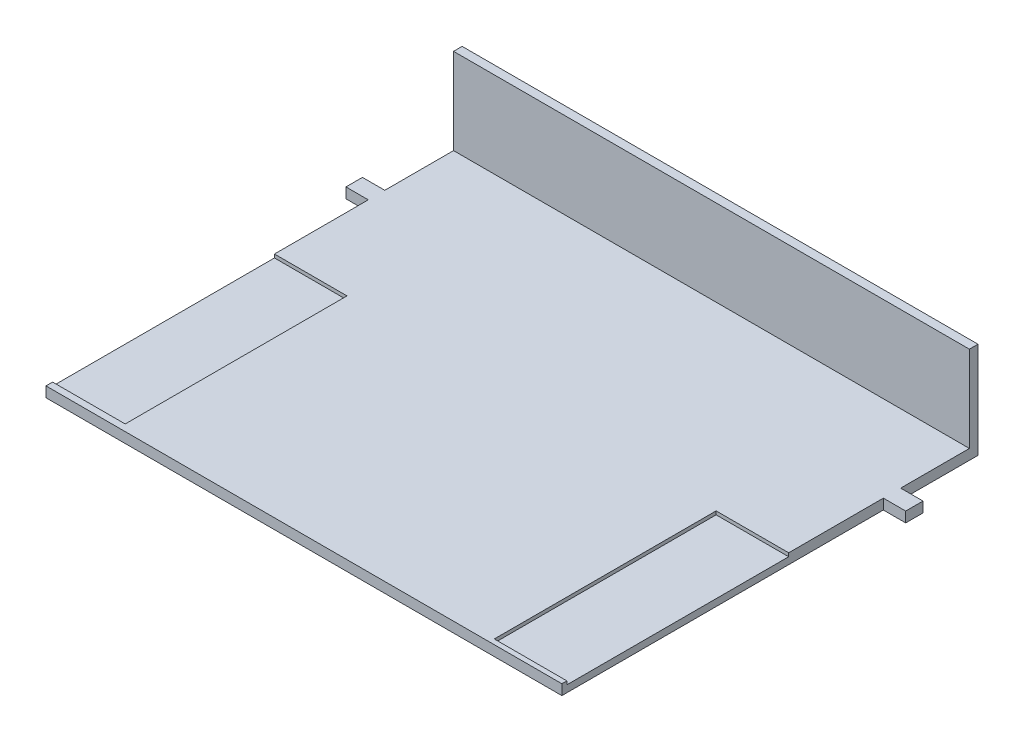
ISO-10303-21;
HEADER;
FILE_DESCRIPTION(('STEP AP214'),'2;1');
FILE_NAME('part.step','',(''),(''),'','','');
FILE_SCHEMA(('AUTOMOTIVE_DESIGN { 1 0 10303 214 1 1 1 1 }'));
ENDSEC;
DATA;
#1=APPLICATION_CONTEXT('core data for automotive mechanical design processes');
#2=APPLICATION_PROTOCOL_DEFINITION('international standard','automotive_design',2000,#1);
#3=PRODUCT_CONTEXT('',#1,'mechanical');
#4=PRODUCT('Part','Part','',(#3));
#5=PRODUCT_RELATED_PRODUCT_CATEGORY('part','',(#4));
#6=PRODUCT_DEFINITION_FORMATION('','',#4);
#7=PRODUCT_DEFINITION_CONTEXT('part definition',#1,'design');
#8=PRODUCT_DEFINITION('design','',#6,#7);
#9=PRODUCT_DEFINITION_SHAPE('','',#8);
#10=(LENGTH_UNIT() NAMED_UNIT(*) SI_UNIT(.MILLI.,.METRE.));
#11=(NAMED_UNIT(*) PLANE_ANGLE_UNIT() SI_UNIT($,.RADIAN.));
#12=(NAMED_UNIT(*) SI_UNIT($,.STERADIAN.) SOLID_ANGLE_UNIT());
#13=UNCERTAINTY_MEASURE_WITH_UNIT(LENGTH_MEASURE(1.E-05),#10,'distance_accuracy_value','');
#14=(GEOMETRIC_REPRESENTATION_CONTEXT(3) GLOBAL_UNCERTAINTY_ASSIGNED_CONTEXT((#13)) GLOBAL_UNIT_ASSIGNED_CONTEXT((#10,
#11,#12)) REPRESENTATION_CONTEXT('',''));
#15=CARTESIAN_POINT('',(0.,0.,0.));
#16=DIRECTION('',(0.,0.,1.));
#17=DIRECTION('',(1.,0.,0.));
#18=AXIS2_PLACEMENT_3D('',#15,#16,#17);
#19=CARTESIAN_POINT('',(0.,3.,121.));
#20=DIRECTION('',(0.,1.,0.));
#21=DIRECTION('',(0.,0.,1.));
#22=AXIS2_PLACEMENT_3D('',#19,#20,#21);
#23=PLANE('',#22);
#24=DIRECTION('',(0.,0.,-1.));
#25=VECTOR('',#24,1.);
#26=CARTESIAN_POINT('',(150.,3.,121.));
#27=LINE('',#26,#25);
#28=CARTESIAN_POINT('',(150.,3.,22.4873306391878));
#29=VERTEX_POINT('',#28);
#30=CARTESIAN_POINT('',(150.,3.,2.5));
#31=VERTEX_POINT('',#30);
#32=EDGE_CURVE('E386',#29,#31,#27,.T.);
#33=ORIENTED_EDGE('',*,*,#32,.T.);
#34=DIRECTION('',(-1.,0.,0.));
#35=VECTOR('',#34,1.);
#36=CARTESIAN_POINT('',(150.,3.,2.5));
#37=LINE('',#36,#35);
#38=CARTESIAN_POINT('',(0.,3.,2.5));
#39=VERTEX_POINT('',#38);
#40=EDGE_CURVE('E215',#31,#39,#37,.T.);
#41=ORIENTED_EDGE('',*,*,#40,.T.);
#42=DIRECTION('',(0.,0.,-1.));
#43=VECTOR('',#42,1.);
#44=CARTESIAN_POINT('',(0.,3.,121.));
#45=LINE('',#44,#43);
#46=CARTESIAN_POINT('',(0.,3.,22.4873306391878));
#47=VERTEX_POINT('',#46);
#48=EDGE_CURVE('E50',#47,#39,#45,.T.);
#49=ORIENTED_EDGE('',*,*,#48,.F.);
#50=DIRECTION('',(-1.,0.,0.));
#51=VECTOR('',#50,1.);
#52=CARTESIAN_POINT('',(0.,3.,22.4873306391878));
#53=LINE('',#52,#51);
#54=CARTESIAN_POINT('',(-6.5,3.,22.4873306391878));
#55=VERTEX_POINT('',#54);
#56=EDGE_CURVE('E263',#47,#55,#53,.T.);
#57=ORIENTED_EDGE('',*,*,#56,.T.);
#58=DIRECTION('',(0.,0.,1.));
#59=VECTOR('',#58,1.);
#60=CARTESIAN_POINT('',(-6.5,3.,22.4873306391878));
#61=LINE('',#60,#59);
#62=CARTESIAN_POINT('',(-6.5,3.,27.2873306391878));
#63=VERTEX_POINT('',#62);
#64=EDGE_CURVE('E267',#55,#63,#61,.T.);
#65=ORIENTED_EDGE('',*,*,#64,.T.);
#66=DIRECTION('',(1.,0.,0.));
#67=VECTOR('',#66,1.);
#68=CARTESIAN_POINT('',(-6.5,3.,27.2873306391878));
#69=LINE('',#68,#67);
#70=CARTESIAN_POINT('',(0.,3.,27.2873306391878));
#71=VERTEX_POINT('',#70);
#72=EDGE_CURVE('E260',#63,#71,#69,.T.);
#73=ORIENTED_EDGE('',*,*,#72,.T.);
#74=CARTESIAN_POINT('',(0.,3.,54.5746612783755));
#75=VERTEX_POINT('',#74);
#76=EDGE_CURVE('E48',#75,#71,#45,.T.);
#77=ORIENTED_EDGE('',*,*,#76,.F.);
#78=DIRECTION('',(-1.,0.,0.));
#79=VECTOR('',#78,1.);
#80=CARTESIAN_POINT('',(21.1,3.,54.5746612783755));
#81=LINE('',#80,#79);
#82=CARTESIAN_POINT('',(21.1,3.,54.5746612783755));
#83=VERTEX_POINT('',#82);
#84=EDGE_CURVE('E323',#83,#75,#81,.T.);
#85=ORIENTED_EDGE('',*,*,#84,.F.);
#86=DIRECTION('',(0.,0.,-1.));
#87=VECTOR('',#86,1.);
#88=CARTESIAN_POINT('',(21.1,3.,119.074661278376));
#89=LINE('',#88,#87);
#90=CARTESIAN_POINT('',(21.1,3.,119.074661278376));
#91=VERTEX_POINT('',#90);
#92=EDGE_CURVE('E336',#91,#83,#89,.T.);
#93=ORIENTED_EDGE('',*,*,#92,.F.);
#94=DIRECTION('',(1.,0.,0.));
#95=VECTOR('',#94,1.);
#96=CARTESIAN_POINT('',(0.,3.,119.074661278376));
#97=LINE('',#96,#95);
#98=CARTESIAN_POINT('',(0.,3.,119.074661278376));
#99=VERTEX_POINT('',#98);
#100=EDGE_CURVE('E351',#99,#91,#97,.T.);
#101=ORIENTED_EDGE('',*,*,#100,.F.);
#102=CARTESIAN_POINT('',(0.,3.,121.));
#103=VERTEX_POINT('',#102);
#104=EDGE_CURVE('E11',#103,#99,#45,.T.);
#105=ORIENTED_EDGE('',*,*,#104,.F.);
#106=DIRECTION('',(1.,0.,0.));
#107=VECTOR('',#106,1.);
#108=CARTESIAN_POINT('',(0.,3.,121.));
#109=LINE('',#108,#107);
#110=CARTESIAN_POINT('',(150.,3.,121.));
#111=VERTEX_POINT('',#110);
#112=EDGE_CURVE('E371',#103,#111,#109,.T.);
#113=ORIENTED_EDGE('',*,*,#112,.T.);
#114=CARTESIAN_POINT('',(150.,3.,119.548299377698));
#115=VERTEX_POINT('',#114);
#116=EDGE_CURVE('E42',#111,#115,#27,.T.);
#117=ORIENTED_EDGE('',*,*,#116,.T.);
#118=DIRECTION('',(1.,0.,0.));
#119=VECTOR('',#118,1.);
#120=CARTESIAN_POINT('',(150.,3.,119.548299377698));
#121=LINE('',#120,#119);
#122=CARTESIAN_POINT('',(128.9,3.,119.548299377698));
#123=VERTEX_POINT('',#122);
#124=EDGE_CURVE('E298',#123,#115,#121,.T.);
#125=ORIENTED_EDGE('',*,*,#124,.F.);
#126=DIRECTION('',(0.,0.,1.));
#127=VECTOR('',#126,1.);
#128=CARTESIAN_POINT('',(128.9,3.,119.548299377698));
#129=LINE('',#128,#127);
#130=CARTESIAN_POINT('',(128.9,3.,55.0482993776977));
#131=VERTEX_POINT('',#130);
#132=EDGE_CURVE('E313',#131,#123,#129,.T.);
#133=ORIENTED_EDGE('',*,*,#132,.F.);
#134=DIRECTION('',(-1.,0.,0.));
#135=VECTOR('',#134,1.);
#136=CARTESIAN_POINT('',(128.9,3.,55.0482993776977));
#137=LINE('',#136,#135);
#138=CARTESIAN_POINT('',(150.,3.,55.0482993776977));
#139=VERTEX_POINT('',#138);
#140=EDGE_CURVE('E292',#139,#131,#137,.T.);
#141=ORIENTED_EDGE('',*,*,#140,.F.);
#142=CARTESIAN_POINT('',(150.,3.,27.5241496888489));
#143=VERTEX_POINT('',#142);
#144=EDGE_CURVE('E413',#139,#143,#27,.T.);
#145=ORIENTED_EDGE('',*,*,#144,.T.);
#146=DIRECTION('',(1.,0.,0.));
#147=VECTOR('',#146,1.);
#148=CARTESIAN_POINT('',(150.,3.,27.5241496888489));
#149=LINE('',#148,#147);
#150=CARTESIAN_POINT('',(156.5,3.,27.5241496888489));
#151=VERTEX_POINT('',#150);
#152=EDGE_CURVE('E65',#143,#151,#149,.T.);
#153=ORIENTED_EDGE('',*,*,#152,.T.);
#154=DIRECTION('',(0.,0.,-1.));
#155=VECTOR('',#154,1.);
#156=CARTESIAN_POINT('',(156.5,3.,27.5241496888489));
#157=LINE('',#156,#155);
#158=CARTESIAN_POINT('',(156.5,3.,22.4873306391878));
#159=VERTEX_POINT('',#158);
#160=EDGE_CURVE('E231',#151,#159,#157,.T.);
#161=ORIENTED_EDGE('',*,*,#160,.T.);
#162=DIRECTION('',(-1.,0.,0.));
#163=VECTOR('',#162,1.);
#164=CARTESIAN_POINT('',(156.5,3.,22.4873306391878));
#165=LINE('',#164,#163);
#166=EDGE_CURVE('E225',#159,#29,#165,.T.);
#167=ORIENTED_EDGE('',*,*,#166,.T.);
#168=EDGE_LOOP('',(#33,#41,#49,#57,#65,#73,#77,#85,#93,#101,#105,#113,#117,#125,#133,#141,#145,
#153,#161,#167));
#169=FACE_BOUND('',#168,.T.);
#170=ADVANCED_FACE('F39',(#169),#23,.T.);
#171=CARTESIAN_POINT('',(150.,0.,121.));
#172=DIRECTION('',(-1.,0.,0.));
#173=DIRECTION('',(0.,0.,1.));
#174=AXIS2_PLACEMENT_3D('',#171,#172,#173);
#175=PLANE('',#174);
#176=DIRECTION('',(0.,1.,0.));
#177=VECTOR('',#176,1.);
#178=CARTESIAN_POINT('',(150.,0.,22.4873306391878));
#179=LINE('',#178,#177);
#180=CARTESIAN_POINT('',(150.,0.,22.4873306391878));
#181=VERTEX_POINT('',#180);
#182=EDGE_CURVE('E239',#181,#29,#179,.T.);
#183=ORIENTED_EDGE('',*,*,#182,.F.);
#184=DIRECTION('',(0.,0.,-1.));
#185=VECTOR('',#184,1.);
#186=CARTESIAN_POINT('',(150.,0.,121.));
#187=LINE('',#186,#185);
#188=CARTESIAN_POINT('',(150.,0.,0.));
#189=VERTEX_POINT('',#188);
#190=EDGE_CURVE('E402',#181,#189,#187,.T.);
#191=ORIENTED_EDGE('',*,*,#190,.T.);
#192=DIRECTION('',(0.,1.,0.));
#193=VECTOR('',#192,1.);
#194=CARTESIAN_POINT('',(150.,0.,0.));
#195=LINE('',#194,#193);
#196=CARTESIAN_POINT('',(150.,28.,0.));
#197=VERTEX_POINT('',#196);
#198=EDGE_CURVE('E361',#189,#197,#195,.T.);
#199=ORIENTED_EDGE('',*,*,#198,.T.);
#200=DIRECTION('',(0.,0.,-1.));
#201=VECTOR('',#200,1.);
#202=CARTESIAN_POINT('',(150.,28.,2.5));
#203=LINE('',#202,#201);
#204=CARTESIAN_POINT('',(150.,28.,2.5));
#205=VERTEX_POINT('',#204);
#206=EDGE_CURVE('E203',#205,#197,#203,.T.);
#207=ORIENTED_EDGE('',*,*,#206,.F.);
#208=DIRECTION('',(0.,-1.,0.));
#209=VECTOR('',#208,1.);
#210=CARTESIAN_POINT('',(150.,3.,2.5));
#211=LINE('',#210,#209);
#212=EDGE_CURVE('E204',#205,#31,#211,.T.);
#213=ORIENTED_EDGE('',*,*,#212,.T.);
#214=ORIENTED_EDGE('',*,*,#32,.F.);
#215=EDGE_LOOP('',(#183,#191,#199,#207,#213,#214));
#216=FACE_BOUND('',#215,.T.);
#217=ADVANCED_FACE('F423',(#216),#175,.F.);
#218=CARTESIAN_POINT('',(0.,0.,121.));
#219=DIRECTION('',(-1.,0.,0.));
#220=DIRECTION('',(0.,0.,1.));
#221=AXIS2_PLACEMENT_3D('',#218,#219,#220);
#222=PLANE('',#221);
#223=ORIENTED_EDGE('',*,*,#76,.T.);
#224=DIRECTION('',(0.,-1.,0.));
#225=VECTOR('',#224,1.);
#226=CARTESIAN_POINT('',(0.,3.,27.2873306391878));
#227=LINE('',#226,#225);
#228=CARTESIAN_POINT('',(0.,0.,27.2873306391878));
#229=VERTEX_POINT('',#228);
#230=EDGE_CURVE('E288',#71,#229,#227,.T.);
#231=ORIENTED_EDGE('',*,*,#230,.T.);
#232=DIRECTION('',(0.,0.,-1.));
#233=VECTOR('',#232,1.);
#234=CARTESIAN_POINT('',(0.,0.,121.));
#235=LINE('',#234,#233);
#236=CARTESIAN_POINT('',(0.,0.,121.));
#237=VERTEX_POINT('',#236);
#238=EDGE_CURVE('E395',#237,#229,#235,.T.);
#239=ORIENTED_EDGE('',*,*,#238,.F.);
#240=DIRECTION('',(0.,1.,0.));
#241=VECTOR('',#240,1.);
#242=CARTESIAN_POINT('',(0.,0.,121.));
#243=LINE('',#242,#241);
#244=EDGE_CURVE('E382',#237,#103,#243,.T.);
#245=ORIENTED_EDGE('',*,*,#244,.T.);
#246=ORIENTED_EDGE('',*,*,#104,.T.);
#247=DIRECTION('',(0.,1.,0.));
#248=VECTOR('',#247,1.);
#249=CARTESIAN_POINT('',(0.,2.,119.074661278376));
#250=LINE('',#249,#248);
#251=CARTESIAN_POINT('',(0.,2.,119.074661278376));
#252=VERTEX_POINT('',#251);
#253=EDGE_CURVE('E365',#252,#99,#250,.T.);
#254=ORIENTED_EDGE('',*,*,#253,.F.);
#255=DIRECTION('',(0.,0.,1.));
#256=VECTOR('',#255,1.);
#257=CARTESIAN_POINT('',(0.,2.,54.5746612783755));
#258=LINE('',#257,#256);
#259=CARTESIAN_POINT('',(0.,2.,54.5746612783755));
#260=VERTEX_POINT('',#259);
#261=EDGE_CURVE('E335',#260,#252,#258,.T.);
#262=ORIENTED_EDGE('',*,*,#261,.F.);
#263=DIRECTION('',(0.,1.,0.));
#264=VECTOR('',#263,1.);
#265=CARTESIAN_POINT('',(0.,2.,54.5746612783755));
#266=LINE('',#265,#264);
#267=EDGE_CURVE('E348',#260,#75,#266,.T.);
#268=ORIENTED_EDGE('',*,*,#267,.T.);
#269=EDGE_LOOP('',(#223,#231,#239,#245,#246,#254,#262,#268));
#270=FACE_BOUND('',#269,.T.);
#271=ADVANCED_FACE('F448',(#270),#222,.T.);
#272=DIRECTION('',(0.,-1.,0.));
#273=VECTOR('',#272,1.);
#274=CARTESIAN_POINT('',(0.,3.,22.4873306391878));
#275=LINE('',#274,#273);
#276=CARTESIAN_POINT('',(0.,0.,22.4873306391878));
#277=VERTEX_POINT('',#276);
#278=EDGE_CURVE('E285',#47,#277,#275,.T.);
#279=ORIENTED_EDGE('',*,*,#278,.F.);
#280=ORIENTED_EDGE('',*,*,#48,.T.);
#281=DIRECTION('',(0.,1.,0.));
#282=VECTOR('',#281,1.);
#283=CARTESIAN_POINT('',(0.,28.,2.5));
#284=LINE('',#283,#282);
#285=CARTESIAN_POINT('',(0.,28.,2.5));
#286=VERTEX_POINT('',#285);
#287=EDGE_CURVE('E57',#39,#286,#284,.T.);
#288=ORIENTED_EDGE('',*,*,#287,.T.);
#289=DIRECTION('',(0.,0.,-1.));
#290=VECTOR('',#289,1.);
#291=CARTESIAN_POINT('',(0.,28.,2.5));
#292=LINE('',#291,#290);
#293=CARTESIAN_POINT('',(0.,28.,0.));
#294=VERTEX_POINT('',#293);
#295=EDGE_CURVE('E193',#286,#294,#292,.T.);
#296=ORIENTED_EDGE('',*,*,#295,.T.);
#297=DIRECTION('',(0.,1.,0.));
#298=VECTOR('',#297,1.);
#299=CARTESIAN_POINT('',(0.,0.,0.));
#300=LINE('',#299,#298);
#301=CARTESIAN_POINT('',(0.,0.,0.));
#302=VERTEX_POINT('',#301);
#303=EDGE_CURVE('E376',#302,#294,#300,.T.);
#304=ORIENTED_EDGE('',*,*,#303,.F.);
#305=EDGE_CURVE('E398',#277,#302,#235,.T.);
#306=ORIENTED_EDGE('',*,*,#305,.F.);
#307=EDGE_LOOP('',(#279,#280,#288,#296,#304,#306));
#308=FACE_BOUND('',#307,.T.);
#309=ADVANCED_FACE('F212',(#308),#222,.T.);
#310=CARTESIAN_POINT('',(0.,0.,121.));
#311=DIRECTION('',(0.,1.,0.));
#312=DIRECTION('',(0.,0.,1.));
#313=AXIS2_PLACEMENT_3D('',#310,#311,#312);
#314=PLANE('',#313);
#315=DIRECTION('',(1.,0.,0.));
#316=VECTOR('',#315,1.);
#317=CARTESIAN_POINT('',(0.,0.,0.));
#318=LINE('',#317,#316);
#319=EDGE_CURVE('E389',#302,#189,#318,.T.);
#320=ORIENTED_EDGE('',*,*,#319,.T.);
#321=ORIENTED_EDGE('',*,*,#190,.F.);
#322=DIRECTION('',(-1.,0.,0.));
#323=VECTOR('',#322,1.);
#324=CARTESIAN_POINT('',(156.5,0.,22.4873306391878));
#325=LINE('',#324,#323);
#326=CARTESIAN_POINT('',(156.5,0.,22.4873306391878));
#327=VERTEX_POINT('',#326);
#328=EDGE_CURVE('E227',#327,#181,#325,.T.);
#329=ORIENTED_EDGE('',*,*,#328,.F.);
#330=DIRECTION('',(0.,0.,-1.));
#331=VECTOR('',#330,1.);
#332=CARTESIAN_POINT('',(156.5,0.,27.5241496888489));
#333=LINE('',#332,#331);
#334=CARTESIAN_POINT('',(156.5,0.,27.5241496888489));
#335=VERTEX_POINT('',#334);
#336=EDGE_CURVE('E235',#335,#327,#333,.T.);
#337=ORIENTED_EDGE('',*,*,#336,.F.);
#338=DIRECTION('',(1.,0.,0.));
#339=VECTOR('',#338,1.);
#340=CARTESIAN_POINT('',(150.,0.,27.5241496888489));
#341=LINE('',#340,#339);
#342=CARTESIAN_POINT('',(150.,0.,27.5241496888489));
#343=VERTEX_POINT('',#342);
#344=EDGE_CURVE('E230',#343,#335,#341,.T.);
#345=ORIENTED_EDGE('',*,*,#344,.F.);
#346=CARTESIAN_POINT('',(150.,0.,121.));
#347=VERTEX_POINT('',#346);
#348=EDGE_CURVE('E399',#347,#343,#187,.T.);
#349=ORIENTED_EDGE('',*,*,#348,.F.);
#350=DIRECTION('',(1.,0.,0.));
#351=VECTOR('',#350,1.);
#352=CARTESIAN_POINT('',(0.,0.,121.));
#353=LINE('',#352,#351);
#354=EDGE_CURVE('E379',#237,#347,#353,.T.);
#355=ORIENTED_EDGE('',*,*,#354,.F.);
#356=ORIENTED_EDGE('',*,*,#238,.T.);
#357=DIRECTION('',(1.,0.,0.));
#358=VECTOR('',#357,1.);
#359=CARTESIAN_POINT('',(-6.5,0.,27.2873306391878));
#360=LINE('',#359,#358);
#361=CARTESIAN_POINT('',(-6.5,0.,27.2873306391878));
#362=VERTEX_POINT('',#361);
#363=EDGE_CURVE('E251',#362,#229,#360,.T.);
#364=ORIENTED_EDGE('',*,*,#363,.F.);
#365=DIRECTION('',(0.,0.,1.));
#366=VECTOR('',#365,1.);
#367=CARTESIAN_POINT('',(-6.5,0.,22.4873306391878));
#368=LINE('',#367,#366);
#369=CARTESIAN_POINT('',(-6.5,0.,22.4873306391878));
#370=VERTEX_POINT('',#369);
#371=EDGE_CURVE('E264',#370,#362,#368,.T.);
#372=ORIENTED_EDGE('',*,*,#371,.F.);
#373=DIRECTION('',(-1.,0.,0.));
#374=VECTOR('',#373,1.);
#375=CARTESIAN_POINT('',(0.,0.,22.4873306391878));
#376=LINE('',#375,#374);
#377=EDGE_CURVE('E273',#277,#370,#376,.T.);
#378=ORIENTED_EDGE('',*,*,#377,.F.);
#379=ORIENTED_EDGE('',*,*,#305,.T.);
#380=EDGE_LOOP('',(#320,#321,#329,#337,#345,#349,#355,#356,#364,#372,#378,#379));
#381=FACE_BOUND('',#380,.T.);
#382=ADVANCED_FACE('F431',(#381),#314,.F.);
#383=ORIENTED_EDGE('',*,*,#348,.T.);
#384=DIRECTION('',(0.,1.,0.));
#385=VECTOR('',#384,1.);
#386=CARTESIAN_POINT('',(150.,0.,27.5241496888489));
#387=LINE('',#386,#385);
#388=EDGE_CURVE('E255',#343,#143,#387,.T.);
#389=ORIENTED_EDGE('',*,*,#388,.T.);
#390=ORIENTED_EDGE('',*,*,#144,.F.);
#391=DIRECTION('',(0.,1.,0.));
#392=VECTOR('',#391,1.);
#393=CARTESIAN_POINT('',(150.,2.,55.0482993776977));
#394=LINE('',#393,#392);
#395=CARTESIAN_POINT('',(150.,2.,55.0482993776977));
#396=VERTEX_POINT('',#395);
#397=EDGE_CURVE('E309',#396,#139,#394,.T.);
#398=ORIENTED_EDGE('',*,*,#397,.F.);
#399=DIRECTION('',(0.,0.,-1.));
#400=VECTOR('',#399,1.);
#401=CARTESIAN_POINT('',(150.,2.,119.548299377698));
#402=LINE('',#401,#400);
#403=CARTESIAN_POINT('',(150.,2.,119.548299377698));
#404=VERTEX_POINT('',#403);
#405=EDGE_CURVE('E293',#404,#396,#402,.T.);
#406=ORIENTED_EDGE('',*,*,#405,.F.);
#407=DIRECTION('',(0.,1.,0.));
#408=VECTOR('',#407,1.);
#409=CARTESIAN_POINT('',(150.,2.,119.548299377698));
#410=LINE('',#409,#408);
#411=EDGE_CURVE('E319',#404,#115,#410,.T.);
#412=ORIENTED_EDGE('',*,*,#411,.T.);
#413=ORIENTED_EDGE('',*,*,#116,.F.);
#414=DIRECTION('',(0.,1.,0.));
#415=VECTOR('',#414,1.);
#416=CARTESIAN_POINT('',(150.,0.,121.));
#417=LINE('',#416,#415);
#418=EDGE_CURVE('E375',#347,#111,#417,.T.);
#419=ORIENTED_EDGE('',*,*,#418,.F.);
#420=EDGE_LOOP('',(#383,#389,#390,#398,#406,#412,#413,#419));
#421=FACE_BOUND('',#420,.T.);
#422=ADVANCED_FACE('F468',(#421),#175,.F.);
#423=CARTESIAN_POINT('',(0.,0.,121.));
#424=DIRECTION('',(0.,0.,1.));
#425=DIRECTION('',(1.,0.,0.));
#426=AXIS2_PLACEMENT_3D('',#423,#424,#425);
#427=PLANE('',#426);
#428=ORIENTED_EDGE('',*,*,#112,.F.);
#429=ORIENTED_EDGE('',*,*,#244,.F.);
#430=ORIENTED_EDGE('',*,*,#354,.T.);
#431=ORIENTED_EDGE('',*,*,#418,.T.);
#432=EDGE_LOOP('',(#428,#429,#430,#431));
#433=FACE_BOUND('',#432,.T.);
#434=ADVANCED_FACE('F467',(#433),#427,.T.);
#435=CARTESIAN_POINT('',(0.,0.,0.));
#436=DIRECTION('',(0.,0.,1.));
#437=DIRECTION('',(1.,0.,0.));
#438=AXIS2_PLACEMENT_3D('',#435,#436,#437);
#439=PLANE('',#438);
#440=ORIENTED_EDGE('',*,*,#303,.T.);
#441=DIRECTION('',(1.,0.,0.));
#442=VECTOR('',#441,1.);
#443=CARTESIAN_POINT('',(150.,28.,0.));
#444=LINE('',#443,#442);
#445=EDGE_CURVE('E199',#294,#197,#444,.T.);
#446=ORIENTED_EDGE('',*,*,#445,.T.);
#447=ORIENTED_EDGE('',*,*,#198,.F.);
#448=ORIENTED_EDGE('',*,*,#319,.F.);
#449=EDGE_LOOP('',(#440,#446,#447,#448));
#450=FACE_BOUND('',#449,.T.);
#451=ADVANCED_FACE('F426',(#450),#439,.F.);
#452=CARTESIAN_POINT('',(21.1,2.,54.5746612783755));
#453=DIRECTION('',(0.,0.,-1.));
#454=DIRECTION('',(-1.,0.,0.));
#455=AXIS2_PLACEMENT_3D('',#452,#453,#454);
#456=PLANE('',#455);
#457=ORIENTED_EDGE('',*,*,#84,.T.);
#458=ORIENTED_EDGE('',*,*,#267,.F.);
#459=DIRECTION('',(-1.,0.,0.));
#460=VECTOR('',#459,1.);
#461=CARTESIAN_POINT('',(21.1,2.,54.5746612783755));
#462=LINE('',#461,#460);
#463=CARTESIAN_POINT('',(21.1,2.,54.5746612783755));
#464=VERTEX_POINT('',#463);
#465=EDGE_CURVE('E332',#464,#260,#462,.T.);
#466=ORIENTED_EDGE('',*,*,#465,.F.);
#467=DIRECTION('',(0.,1.,0.));
#468=VECTOR('',#467,1.);
#469=CARTESIAN_POINT('',(21.1,2.,54.5746612783755));
#470=LINE('',#469,#468);
#471=EDGE_CURVE('E358',#464,#83,#470,.T.);
#472=ORIENTED_EDGE('',*,*,#471,.T.);
#473=EDGE_LOOP('',(#457,#458,#466,#472));
#474=FACE_BOUND('',#473,.T.);
#475=ADVANCED_FACE('F455',(#474),#456,.F.);
#476=CARTESIAN_POINT('',(21.1,2.,119.074661278376));
#477=DIRECTION('',(1.,0.,0.));
#478=DIRECTION('',(0.,0.,-1.));
#479=AXIS2_PLACEMENT_3D('',#476,#477,#478);
#480=PLANE('',#479);
#481=ORIENTED_EDGE('',*,*,#92,.T.);
#482=ORIENTED_EDGE('',*,*,#471,.F.);
#483=DIRECTION('',(0.,0.,-1.));
#484=VECTOR('',#483,1.);
#485=CARTESIAN_POINT('',(21.1,2.,119.074661278376));
#486=LINE('',#485,#484);
#487=CARTESIAN_POINT('',(21.1,2.,119.074661278376));
#488=VERTEX_POINT('',#487);
#489=EDGE_CURVE('E344',#488,#464,#486,.T.);
#490=ORIENTED_EDGE('',*,*,#489,.F.);
#491=DIRECTION('',(0.,1.,0.));
#492=VECTOR('',#491,1.);
#493=CARTESIAN_POINT('',(21.1,2.,119.074661278376));
#494=LINE('',#493,#492);
#495=EDGE_CURVE('E362',#488,#91,#494,.T.);
#496=ORIENTED_EDGE('',*,*,#495,.T.);
#497=EDGE_LOOP('',(#481,#482,#490,#496));
#498=FACE_BOUND('',#497,.T.);
#499=ADVANCED_FACE('F459',(#498),#480,.F.);
#500=CARTESIAN_POINT('',(0.,2.,119.074661278376));
#501=DIRECTION('',(0.,0.,1.));
#502=DIRECTION('',(1.,0.,0.));
#503=AXIS2_PLACEMENT_3D('',#500,#501,#502);
#504=PLANE('',#503);
#505=ORIENTED_EDGE('',*,*,#100,.T.);
#506=ORIENTED_EDGE('',*,*,#495,.F.);
#507=DIRECTION('',(1.,0.,0.));
#508=VECTOR('',#507,1.);
#509=CARTESIAN_POINT('',(0.,2.,119.074661278376));
#510=LINE('',#509,#508);
#511=EDGE_CURVE('E340',#252,#488,#510,.T.);
#512=ORIENTED_EDGE('',*,*,#511,.F.);
#513=ORIENTED_EDGE('',*,*,#253,.T.);
#514=EDGE_LOOP('',(#505,#506,#512,#513));
#515=FACE_BOUND('',#514,.T.);
#516=ADVANCED_FACE('F461',(#515),#504,.F.);
#517=CARTESIAN_POINT('',(0.,2.,0.));
#518=DIRECTION('',(0.,1.,0.));
#519=DIRECTION('',(0.,0.,1.));
#520=AXIS2_PLACEMENT_3D('',#517,#518,#519);
#521=PLANE('',#520);
#522=ORIENTED_EDGE('',*,*,#465,.T.);
#523=ORIENTED_EDGE('',*,*,#261,.T.);
#524=ORIENTED_EDGE('',*,*,#511,.T.);
#525=ORIENTED_EDGE('',*,*,#489,.T.);
#526=EDGE_LOOP('',(#522,#523,#524,#525));
#527=FACE_BOUND('',#526,.T.);
#528=ADVANCED_FACE('F526',(#527),#521,.T.);
#529=CARTESIAN_POINT('',(150.,2.,119.548299377698));
#530=DIRECTION('',(0.,0.,1.));
#531=DIRECTION('',(1.,0.,0.));
#532=AXIS2_PLACEMENT_3D('',#529,#530,#531);
#533=PLANE('',#532);
#534=ORIENTED_EDGE('',*,*,#124,.T.);
#535=ORIENTED_EDGE('',*,*,#411,.F.);
#536=DIRECTION('',(1.,0.,0.));
#537=VECTOR('',#536,1.);
#538=CARTESIAN_POINT('',(150.,2.,119.548299377698));
#539=LINE('',#538,#537);
#540=CARTESIAN_POINT('',(128.9,2.,119.548299377698));
#541=VERTEX_POINT('',#540);
#542=EDGE_CURVE('E306',#541,#404,#539,.T.);
#543=ORIENTED_EDGE('',*,*,#542,.F.);
#544=DIRECTION('',(0.,1.,0.));
#545=VECTOR('',#544,1.);
#546=CARTESIAN_POINT('',(128.9,2.,119.548299377698));
#547=LINE('',#546,#545);
#548=EDGE_CURVE('E324',#541,#123,#547,.T.);
#549=ORIENTED_EDGE('',*,*,#548,.T.);
#550=EDGE_LOOP('',(#534,#535,#543,#549));
#551=FACE_BOUND('',#550,.T.);
#552=ADVANCED_FACE('F474',(#551),#533,.F.);
#553=CARTESIAN_POINT('',(128.9,2.,119.548299377698));
#554=DIRECTION('',(-1.,0.,0.));
#555=DIRECTION('',(0.,0.,1.));
#556=AXIS2_PLACEMENT_3D('',#553,#554,#555);
#557=PLANE('',#556);
#558=ORIENTED_EDGE('',*,*,#132,.T.);
#559=ORIENTED_EDGE('',*,*,#548,.F.);
#560=DIRECTION('',(0.,0.,1.));
#561=VECTOR('',#560,1.);
#562=CARTESIAN_POINT('',(128.9,2.,119.548299377698));
#563=LINE('',#562,#561);
#564=CARTESIAN_POINT('',(128.9,2.,55.0482993776977));
#565=VERTEX_POINT('',#564);
#566=EDGE_CURVE('E302',#565,#541,#563,.T.);
#567=ORIENTED_EDGE('',*,*,#566,.F.);
#568=DIRECTION('',(0.,1.,0.));
#569=VECTOR('',#568,1.);
#570=CARTESIAN_POINT('',(128.9,2.,55.0482993776977));
#571=LINE('',#570,#569);
#572=EDGE_CURVE('E327',#565,#131,#571,.T.);
#573=ORIENTED_EDGE('',*,*,#572,.T.);
#574=EDGE_LOOP('',(#558,#559,#567,#573));
#575=FACE_BOUND('',#574,.T.);
#576=ADVANCED_FACE('F479',(#575),#557,.F.);
#577=CARTESIAN_POINT('',(128.9,2.,55.0482993776977));
#578=DIRECTION('',(0.,0.,-1.));
#579=DIRECTION('',(-1.,0.,0.));
#580=AXIS2_PLACEMENT_3D('',#577,#578,#579);
#581=PLANE('',#580);
#582=ORIENTED_EDGE('',*,*,#140,.T.);
#583=ORIENTED_EDGE('',*,*,#572,.F.);
#584=DIRECTION('',(-1.,0.,0.));
#585=VECTOR('',#584,1.);
#586=CARTESIAN_POINT('',(128.9,2.,55.0482993776977));
#587=LINE('',#586,#585);
#588=EDGE_CURVE('E297',#396,#565,#587,.T.);
#589=ORIENTED_EDGE('',*,*,#588,.F.);
#590=ORIENTED_EDGE('',*,*,#397,.T.);
#591=EDGE_LOOP('',(#582,#583,#589,#590));
#592=FACE_BOUND('',#591,.T.);
#593=ADVANCED_FACE('F482',(#592),#581,.F.);
#594=CARTESIAN_POINT('',(0.,2.,0.));
#595=DIRECTION('',(0.,-1.,0.));
#596=DIRECTION('',(0.,0.,-1.));
#597=AXIS2_PLACEMENT_3D('',#594,#595,#596);
#598=PLANE('',#597);
#599=ORIENTED_EDGE('',*,*,#405,.T.);
#600=ORIENTED_EDGE('',*,*,#588,.T.);
#601=ORIENTED_EDGE('',*,*,#566,.T.);
#602=ORIENTED_EDGE('',*,*,#542,.T.);
#603=EDGE_LOOP('',(#599,#600,#601,#602));
#604=FACE_BOUND('',#603,.T.);
#605=ADVANCED_FACE('F534',(#604),#598,.F.);
#606=CARTESIAN_POINT('',(-6.5,3.,27.2873306391878));
#607=DIRECTION('',(0.,0.,-1.));
#608=DIRECTION('',(-1.,0.,0.));
#609=AXIS2_PLACEMENT_3D('',#606,#607,#608);
#610=PLANE('',#609);
#611=ORIENTED_EDGE('',*,*,#363,.T.);
#612=ORIENTED_EDGE('',*,*,#230,.F.);
#613=ORIENTED_EDGE('',*,*,#72,.F.);
#614=DIRECTION('',(0.,-1.,0.));
#615=VECTOR('',#614,1.);
#616=CARTESIAN_POINT('',(-6.5,3.,27.2873306391878));
#617=LINE('',#616,#615);
#618=EDGE_CURVE('E270',#63,#362,#617,.T.);
#619=ORIENTED_EDGE('',*,*,#618,.T.);
#620=EDGE_LOOP('',(#611,#612,#613,#619));
#621=FACE_BOUND('',#620,.T.);
#622=ADVANCED_FACE('F541',(#621),#610,.F.);
#623=CARTESIAN_POINT('',(0.,3.,22.4873306391878));
#624=DIRECTION('',(0.,0.,1.));
#625=DIRECTION('',(1.,0.,0.));
#626=AXIS2_PLACEMENT_3D('',#623,#624,#625);
#627=PLANE('',#626);
#628=ORIENTED_EDGE('',*,*,#377,.T.);
#629=DIRECTION('',(0.,-1.,0.));
#630=VECTOR('',#629,1.);
#631=CARTESIAN_POINT('',(-6.5,3.,22.4873306391878));
#632=LINE('',#631,#630);
#633=EDGE_CURVE('E281',#55,#370,#632,.T.);
#634=ORIENTED_EDGE('',*,*,#633,.F.);
#635=ORIENTED_EDGE('',*,*,#56,.F.);
#636=ORIENTED_EDGE('',*,*,#278,.T.);
#637=EDGE_LOOP('',(#628,#634,#635,#636));
#638=FACE_BOUND('',#637,.T.);
#639=ADVANCED_FACE('F436',(#638),#627,.F.);
#640=CARTESIAN_POINT('',(-6.5,3.,22.4873306391878));
#641=DIRECTION('',(1.,0.,0.));
#642=DIRECTION('',(0.,0.,-1.));
#643=AXIS2_PLACEMENT_3D('',#640,#641,#642);
#644=PLANE('',#643);
#645=ORIENTED_EDGE('',*,*,#371,.T.);
#646=ORIENTED_EDGE('',*,*,#618,.F.);
#647=ORIENTED_EDGE('',*,*,#64,.F.);
#648=ORIENTED_EDGE('',*,*,#633,.T.);
#649=EDGE_LOOP('',(#645,#646,#647,#648));
#650=FACE_BOUND('',#649,.T.);
#651=ADVANCED_FACE('F439',(#650),#644,.F.);
#652=CARTESIAN_POINT('',(156.5,0.,22.4873306391878));
#653=DIRECTION('',(0.,0.,-1.));
#654=DIRECTION('',(-1.,0.,0.));
#655=AXIS2_PLACEMENT_3D('',#652,#653,#654);
#656=PLANE('',#655);
#657=ORIENTED_EDGE('',*,*,#166,.F.);
#658=DIRECTION('',(0.,1.,0.));
#659=VECTOR('',#658,1.);
#660=CARTESIAN_POINT('',(156.5,0.,22.4873306391878));
#661=LINE('',#660,#659);
#662=EDGE_CURVE('E248',#327,#159,#661,.T.);
#663=ORIENTED_EDGE('',*,*,#662,.F.);
#664=ORIENTED_EDGE('',*,*,#328,.T.);
#665=ORIENTED_EDGE('',*,*,#182,.T.);
#666=EDGE_LOOP('',(#657,#663,#664,#665));
#667=FACE_BOUND('',#666,.T.);
#668=ADVANCED_FACE('F489',(#667),#656,.T.);
#669=CARTESIAN_POINT('',(156.5,0.,27.5241496888489));
#670=DIRECTION('',(1.,0.,0.));
#671=DIRECTION('',(0.,0.,-1.));
#672=AXIS2_PLACEMENT_3D('',#669,#670,#671);
#673=PLANE('',#672);
#674=ORIENTED_EDGE('',*,*,#160,.F.);
#675=DIRECTION('',(0.,1.,0.));
#676=VECTOR('',#675,1.);
#677=CARTESIAN_POINT('',(156.5,0.,27.5241496888489));
#678=LINE('',#677,#676);
#679=EDGE_CURVE('E252',#335,#151,#678,.T.);
#680=ORIENTED_EDGE('',*,*,#679,.F.);
#681=ORIENTED_EDGE('',*,*,#336,.T.);
#682=ORIENTED_EDGE('',*,*,#662,.T.);
#683=EDGE_LOOP('',(#674,#680,#681,#682));
#684=FACE_BOUND('',#683,.T.);
#685=ADVANCED_FACE('F485',(#684),#673,.T.);
#686=CARTESIAN_POINT('',(150.,0.,27.5241496888489));
#687=DIRECTION('',(0.,0.,1.));
#688=DIRECTION('',(1.,0.,0.));
#689=AXIS2_PLACEMENT_3D('',#686,#687,#688);
#690=PLANE('',#689);
#691=ORIENTED_EDGE('',*,*,#152,.F.);
#692=ORIENTED_EDGE('',*,*,#388,.F.);
#693=ORIENTED_EDGE('',*,*,#344,.T.);
#694=ORIENTED_EDGE('',*,*,#679,.T.);
#695=EDGE_LOOP('',(#691,#692,#693,#694));
#696=FACE_BOUND('',#695,.T.);
#697=ADVANCED_FACE('F491',(#696),#690,.T.);
#698=CARTESIAN_POINT('',(150.,28.,2.5));
#699=DIRECTION('',(0.,1.,0.));
#700=DIRECTION('',(0.,0.,1.));
#701=AXIS2_PLACEMENT_3D('',#698,#699,#700);
#702=PLANE('',#701);
#703=ORIENTED_EDGE('',*,*,#445,.F.);
#704=ORIENTED_EDGE('',*,*,#295,.F.);
#705=DIRECTION('',(1.,0.,0.));
#706=VECTOR('',#705,1.);
#707=CARTESIAN_POINT('',(150.,28.,2.5));
#708=LINE('',#707,#706);
#709=EDGE_CURVE('E196',#286,#205,#708,.T.);
#710=ORIENTED_EDGE('',*,*,#709,.T.);
#711=ORIENTED_EDGE('',*,*,#206,.T.);
#712=EDGE_LOOP('',(#703,#704,#710,#711));
#713=FACE_BOUND('',#712,.T.);
#714=ADVANCED_FACE('F194',(#713),#702,.T.);
#715=CARTESIAN_POINT('',(0.,0.,2.5));
#716=DIRECTION('',(0.,0.,1.));
#717=DIRECTION('',(1.,0.,0.));
#718=AXIS2_PLACEMENT_3D('',#715,#716,#717);
#719=PLANE('',#718);
#720=ORIENTED_EDGE('',*,*,#40,.F.);
#721=ORIENTED_EDGE('',*,*,#212,.F.);
#722=ORIENTED_EDGE('',*,*,#709,.F.);
#723=ORIENTED_EDGE('',*,*,#287,.F.);
#724=EDGE_LOOP('',(#720,#721,#722,#723));
#725=FACE_BOUND('',#724,.T.);
#726=ADVANCED_FACE('F206',(#725),#719,.T.);
#727=CLOSED_SHELL('',(#170,#217,#271,#309,#382,#422,#434,#451,#475,#499,#516,#528,#552,#576,
#593,#605,#622,#639,#651,#668,#685,#697,#714,#726));
#728=MANIFOLD_SOLID_BREP('B2',#727);
#729=ADVANCED_BREP_SHAPE_REPRESENTATION('',(#18,#728),#14);
#730=SHAPE_DEFINITION_REPRESENTATION(#9,#729);
ENDSEC;
END-ISO-10303-21;
